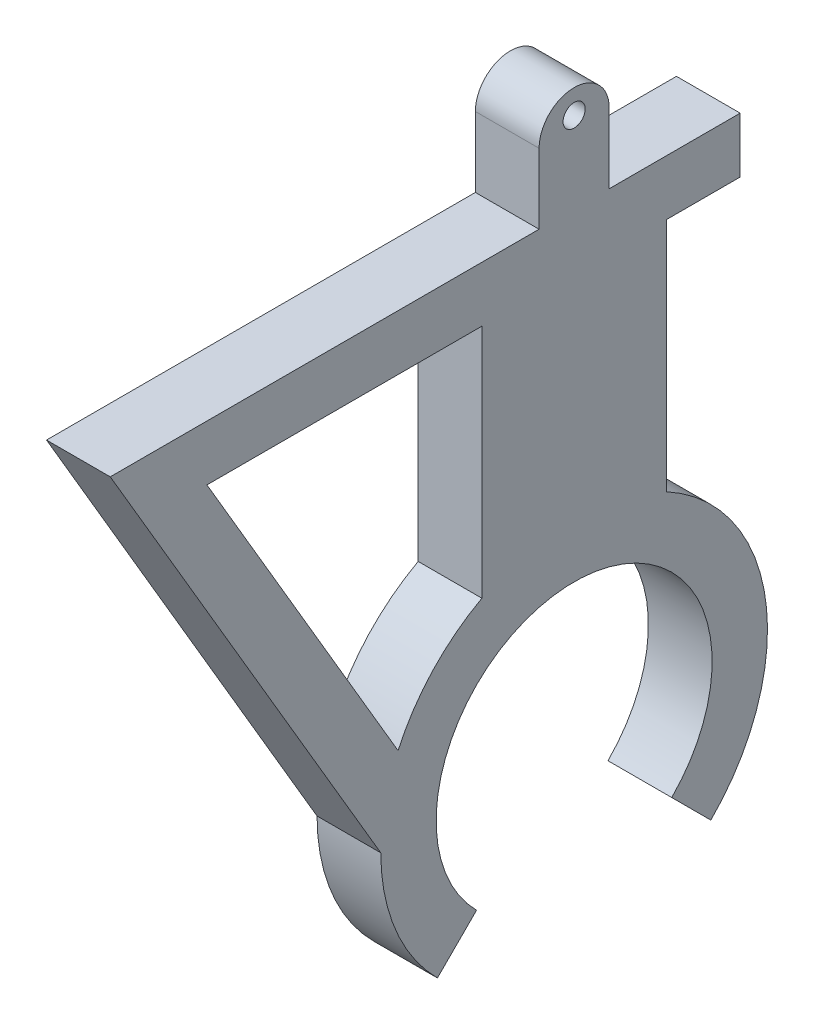
ISO-10303-21;
HEADER;
FILE_DESCRIPTION(('STEP AP214'),'2;1');
FILE_NAME('part.step','',(''),(''),'','','');
FILE_SCHEMA(('AUTOMOTIVE_DESIGN { 1 0 10303 214 1 1 1 1 }'));
ENDSEC;
DATA;
#1=APPLICATION_CONTEXT('core data for automotive mechanical design processes');
#2=APPLICATION_PROTOCOL_DEFINITION('international standard','automotive_design',2000,#1);
#3=PRODUCT_CONTEXT('',#1,'mechanical');
#4=PRODUCT('Part','Part','',(#3));
#5=PRODUCT_RELATED_PRODUCT_CATEGORY('part','',(#4));
#6=PRODUCT_DEFINITION_FORMATION('','',#4);
#7=PRODUCT_DEFINITION_CONTEXT('part definition',#1,'design');
#8=PRODUCT_DEFINITION('design','',#6,#7);
#9=PRODUCT_DEFINITION_SHAPE('','',#8);
#10=(LENGTH_UNIT() NAMED_UNIT(*) SI_UNIT(.MILLI.,.METRE.));
#11=(NAMED_UNIT(*) PLANE_ANGLE_UNIT() SI_UNIT($,.RADIAN.));
#12=(NAMED_UNIT(*) SI_UNIT($,.STERADIAN.) SOLID_ANGLE_UNIT());
#13=UNCERTAINTY_MEASURE_WITH_UNIT(LENGTH_MEASURE(1.E-05),#10,'distance_accuracy_value','');
#14=(GEOMETRIC_REPRESENTATION_CONTEXT(3) GLOBAL_UNCERTAINTY_ASSIGNED_CONTEXT((#13)) GLOBAL_UNIT_ASSIGNED_CONTEXT((#10,
#11,#12)) REPRESENTATION_CONTEXT('',''));
#15=CARTESIAN_POINT('',(0.,0.,0.));
#16=DIRECTION('',(0.,0.,1.));
#17=DIRECTION('',(1.,0.,0.));
#18=AXIS2_PLACEMENT_3D('',#15,#16,#17);
#19=CARTESIAN_POINT('',(1.7272,14.3906839385836,0.));
#20=DIRECTION('',(-1.,0.,0.));
#21=DIRECTION('',(0.,0.,1.));
#22=AXIS2_PLACEMENT_3D('',#19,#20,#21);
#23=CYLINDRICAL_SURFACE('',#22,0.95);
#24=CARTESIAN_POINT('',(0.,14.3906839385836,0.));
#25=DIRECTION('',(1.,0.,0.));
#26=DIRECTION('',(0.,0.,-1.));
#27=AXIS2_PLACEMENT_3D('',#24,#25,#26);
#28=CIRCLE('',#27,0.95);
#29=CARTESIAN_POINT('',(0.,14.3906839385836,0.95));
#30=VERTEX_POINT('',#29);
#31=CARTESIAN_POINT('',(0.,14.3906839385836,-0.95));
#32=VERTEX_POINT('',#31);
#33=EDGE_CURVE('E212',#30,#32,#28,.F.);
#34=ORIENTED_EDGE('',*,*,#33,.F.);
#35=DIRECTION('',(-1.,0.,0.));
#36=VECTOR('',#35,1.);
#37=CARTESIAN_POINT('',(1.7272,14.3906839385836,0.95));
#38=LINE('',#37,#36);
#39=CARTESIAN_POINT('',(1.7272,14.3906839385836,0.95));
#40=VERTEX_POINT('',#39);
#41=EDGE_CURVE('E11',#40,#30,#38,.T.);
#42=ORIENTED_EDGE('',*,*,#41,.F.);
#43=CARTESIAN_POINT('',(1.7272,14.3906839385836,0.));
#44=DIRECTION('',(1.,0.,0.));
#45=DIRECTION('',(0.,0.,-1.));
#46=AXIS2_PLACEMENT_3D('',#43,#44,#45);
#47=CIRCLE('',#46,0.95);
#48=CARTESIAN_POINT('',(1.7272,14.3906839385836,-0.95));
#49=VERTEX_POINT('',#48);
#50=EDGE_CURVE('E397',#40,#49,#47,.F.);
#51=ORIENTED_EDGE('',*,*,#50,.T.);
#52=DIRECTION('',(-1.,0.,0.));
#53=VECTOR('',#52,1.);
#54=CARTESIAN_POINT('',(1.7272,14.3906839385836,-0.95));
#55=LINE('',#54,#53);
#56=EDGE_CURVE('E54',#49,#32,#55,.T.);
#57=ORIENTED_EDGE('',*,*,#56,.T.);
#58=EDGE_LOOP('',(#34,#42,#51,#57));
#59=FACE_BOUND('',#58,.T.);
#60=ADVANCED_FACE('F35',(#59),#23,.T.);
#61=CARTESIAN_POINT('',(1.7272,5.90395315443278,0.95));
#62=DIRECTION('',(0.,0.,-1.));
#63=DIRECTION('',(0.,1.,0.));
#64=AXIS2_PLACEMENT_3D('',#61,#62,#63);
#65=PLANE('',#64);
#66=DIRECTION('',(0.,-1.,0.));
#67=VECTOR('',#66,1.);
#68=CARTESIAN_POINT('',(0.,5.90395315443278,0.95));
#69=LINE('',#68,#67);
#70=CARTESIAN_POINT('',(0.,12.4906839385836,0.95));
#71=VERTEX_POINT('',#70);
#72=EDGE_CURVE('E214',#30,#71,#69,.T.);
#73=ORIENTED_EDGE('',*,*,#72,.T.);
#74=DIRECTION('',(-1.,0.,0.));
#75=VECTOR('',#74,1.);
#76=CARTESIAN_POINT('',(1.7272,12.4906839385836,0.95));
#77=LINE('',#76,#75);
#78=CARTESIAN_POINT('',(1.7272,12.4906839385836,0.95));
#79=VERTEX_POINT('',#78);
#80=EDGE_CURVE('E45',#79,#71,#77,.T.);
#81=ORIENTED_EDGE('',*,*,#80,.F.);
#82=DIRECTION('',(0.,-1.,0.));
#83=VECTOR('',#82,1.);
#84=CARTESIAN_POINT('',(1.7272,5.90395315443278,0.95));
#85=LINE('',#84,#83);
#86=EDGE_CURVE('E399',#40,#79,#85,.T.);
#87=ORIENTED_EDGE('',*,*,#86,.F.);
#88=ORIENTED_EDGE('',*,*,#41,.T.);
#89=EDGE_LOOP('',(#73,#81,#87,#88));
#90=FACE_BOUND('',#89,.T.);
#91=ADVANCED_FACE('F308',(#90),#65,.F.);
#92=CARTESIAN_POINT('',(1.7272,12.4906839385836,-18.7723506815405));
#93=DIRECTION('',(0.,1.,0.));
#94=DIRECTION('',(0.,0.,1.));
#95=AXIS2_PLACEMENT_3D('',#92,#93,#94);
#96=PLANE('',#95);
#97=DIRECTION('',(0.,0.,-1.));
#98=VECTOR('',#97,1.);
#99=CARTESIAN_POINT('',(0.,12.4906839385836,-18.7723506815405));
#100=LINE('',#99,#98);
#101=CARTESIAN_POINT('',(0.,12.4906839385836,12.5716220282199));
#102=VERTEX_POINT('',#101);
#103=EDGE_CURVE('E217',#102,#71,#100,.T.);
#104=ORIENTED_EDGE('',*,*,#103,.F.);
#105=DIRECTION('',(-1.,0.,0.));
#106=VECTOR('',#105,1.);
#107=CARTESIAN_POINT('',(1.7272,12.4906839385836,12.5716220282199));
#108=LINE('',#107,#106);
#109=CARTESIAN_POINT('',(1.7272,12.4906839385836,12.5716220282199));
#110=VERTEX_POINT('',#109);
#111=EDGE_CURVE('E265',#110,#102,#108,.T.);
#112=ORIENTED_EDGE('',*,*,#111,.F.);
#113=DIRECTION('',(0.,0.,-1.));
#114=VECTOR('',#113,1.);
#115=CARTESIAN_POINT('',(1.7272,12.4906839385836,-18.7723506815405));
#116=LINE('',#115,#114);
#117=EDGE_CURVE('E402',#110,#79,#116,.T.);
#118=ORIENTED_EDGE('',*,*,#117,.T.);
#119=ORIENTED_EDGE('',*,*,#80,.T.);
#120=EDGE_LOOP('',(#104,#112,#118,#119));
#121=FACE_BOUND('',#120,.T.);
#122=ADVANCED_FACE('F313',(#121),#96,.T.);
#123=CARTESIAN_POINT('',(1.7272,-6.0917245583196,1.66435737056293));
#124=DIRECTION('',(0.,0.506207430960336,-0.86241175597306));
#125=DIRECTION('',(0.,0.86241175597306,0.506207430960336));
#126=AXIS2_PLACEMENT_3D('',#123,#124,#125);
#127=PLANE('',#126);
#128=DIRECTION('',(0.,-0.86241175597306,-0.506207430960336));
#129=VECTOR('',#128,1.);
#130=CARTESIAN_POINT('',(0.,-6.0917245583196,1.66435737056293));
#131=LINE('',#130,#129);
#132=CARTESIAN_POINT('',(0.,0.,5.24));
#133=VERTEX_POINT('',#132);
#134=EDGE_CURVE('E220',#102,#133,#131,.T.);
#135=ORIENTED_EDGE('',*,*,#134,.T.);
#136=DIRECTION('',(-1.,0.,0.));
#137=VECTOR('',#136,1.);
#138=CARTESIAN_POINT('',(1.7272,0.,5.24));
#139=LINE('',#138,#137);
#140=CARTESIAN_POINT('',(1.7272,0.,5.24));
#141=VERTEX_POINT('',#140);
#142=EDGE_CURVE('E263',#141,#133,#139,.T.);
#143=ORIENTED_EDGE('',*,*,#142,.F.);
#144=DIRECTION('',(0.,-0.86241175597306,-0.506207430960336));
#145=VECTOR('',#144,1.);
#146=CARTESIAN_POINT('',(1.7272,-6.0917245583196,1.66435737056293));
#147=LINE('',#146,#145);
#148=EDGE_CURVE('E379',#110,#141,#147,.T.);
#149=ORIENTED_EDGE('',*,*,#148,.F.);
#150=ORIENTED_EDGE('',*,*,#111,.T.);
#151=EDGE_LOOP('',(#135,#143,#149,#150));
#152=FACE_BOUND('',#151,.T.);
#153=ADVANCED_FACE('F305',(#152),#127,.F.);
#154=CARTESIAN_POINT('',(1.7272,0.,0.));
#155=DIRECTION('',(-1.,0.,0.));
#156=DIRECTION('',(0.,0.,1.));
#157=AXIS2_PLACEMENT_3D('',#154,#155,#156);
#158=CYLINDRICAL_SURFACE('',#157,5.24);
#159=CARTESIAN_POINT('',(0.,0.,0.));
#160=DIRECTION('',(1.,0.,0.));
#161=DIRECTION('',(0.,0.,-1.));
#162=AXIS2_PLACEMENT_3D('',#159,#160,#161);
#163=CIRCLE('',#162,5.24);
#164=CARTESIAN_POINT('',(0.,-3.70523953341749,3.70523953341752));
#165=VERTEX_POINT('',#164);
#166=EDGE_CURVE('E206',#165,#133,#163,.F.);
#167=ORIENTED_EDGE('',*,*,#166,.F.);
#168=DIRECTION('',(-1.,0.,0.));
#169=VECTOR('',#168,1.);
#170=CARTESIAN_POINT('',(1.7272,-3.70523953341749,3.70523953341752));
#171=LINE('',#170,#169);
#172=CARTESIAN_POINT('',(1.7272,-3.70523953341749,3.70523953341752));
#173=VERTEX_POINT('',#172);
#174=EDGE_CURVE('E261',#173,#165,#171,.T.);
#175=ORIENTED_EDGE('',*,*,#174,.F.);
#176=CARTESIAN_POINT('',(1.7272,0.,0.));
#177=DIRECTION('',(1.,0.,0.));
#178=DIRECTION('',(0.,0.,-1.));
#179=AXIS2_PLACEMENT_3D('',#176,#177,#178);
#180=CIRCLE('',#179,5.24);
#181=EDGE_CURVE('E377',#173,#141,#180,.F.);
#182=ORIENTED_EDGE('',*,*,#181,.T.);
#183=ORIENTED_EDGE('',*,*,#142,.T.);
#184=EDGE_LOOP('',(#167,#175,#182,#183));
#185=FACE_BOUND('',#184,.T.);
#186=ADVANCED_FACE('F294',(#185),#158,.T.);
#187=CARTESIAN_POINT('',(1.7272,12.3381519179866,-12.3381519179867));
#188=DIRECTION('',(0.,-0.707106781186552,-0.707106781186543));
#189=DIRECTION('',(0.,0.707106781186543,-0.707106781186552));
#190=AXIS2_PLACEMENT_3D('',#187,#188,#189);
#191=PLANE('',#190);
#192=DIRECTION('',(0.,-0.707106781186543,0.707106781186552));
#193=VECTOR('',#192,1.);
#194=CARTESIAN_POINT('',(0.,12.3381519179866,-12.3381519179867));
#195=LINE('',#194,#193);
#196=CARTESIAN_POINT('',(0.,-2.64457936163768,2.6445793616377));
#197=VERTEX_POINT('',#196);
#198=EDGE_CURVE('E223',#197,#165,#195,.T.);
#199=ORIENTED_EDGE('',*,*,#198,.F.);
#200=DIRECTION('',(-1.,0.,0.));
#201=VECTOR('',#200,1.);
#202=CARTESIAN_POINT('',(1.7272,-2.64457936163768,2.6445793616377));
#203=LINE('',#202,#201);
#204=CARTESIAN_POINT('',(1.7272,-2.64457936163768,2.6445793616377));
#205=VERTEX_POINT('',#204);
#206=EDGE_CURVE('E259',#205,#197,#203,.T.);
#207=ORIENTED_EDGE('',*,*,#206,.F.);
#208=DIRECTION('',(0.,-0.707106781186543,0.707106781186552));
#209=VECTOR('',#208,1.);
#210=CARTESIAN_POINT('',(1.7272,12.3381519179866,-12.3381519179867));
#211=LINE('',#210,#209);
#212=EDGE_CURVE('E373',#205,#173,#211,.T.);
#213=ORIENTED_EDGE('',*,*,#212,.T.);
#214=ORIENTED_EDGE('',*,*,#174,.T.);
#215=EDGE_LOOP('',(#199,#207,#213,#214));
#216=FACE_BOUND('',#215,.T.);
#217=ADVANCED_FACE('F304',(#216),#191,.T.);
#218=CARTESIAN_POINT('',(1.7272,0.,0.));
#219=DIRECTION('',(-1.,0.,0.));
#220=DIRECTION('',(0.,0.,1.));
#221=AXIS2_PLACEMENT_3D('',#218,#219,#220);
#222=CYLINDRICAL_SURFACE('',#221,3.74);
#223=CARTESIAN_POINT('',(0.,0.,0.));
#224=DIRECTION('',(1.,0.,0.));
#225=DIRECTION('',(0.,0.,-1.));
#226=AXIS2_PLACEMENT_3D('',#223,#224,#225);
#227=CIRCLE('',#226,3.74);
#228=CARTESIAN_POINT('',(0.,-2.64457936163768,-2.64457936163769));
#229=VERTEX_POINT('',#228);
#230=EDGE_CURVE('E226',#197,#229,#227,.F.);
#231=ORIENTED_EDGE('',*,*,#230,.T.);
#232=DIRECTION('',(-1.,0.,0.));
#233=VECTOR('',#232,1.);
#234=CARTESIAN_POINT('',(1.7272,-2.64457936163768,-2.64457936163769));
#235=LINE('',#234,#233);
#236=CARTESIAN_POINT('',(1.7272,-2.64457936163768,-2.64457936163769));
#237=VERTEX_POINT('',#236);
#238=EDGE_CURVE('E257',#237,#229,#235,.T.);
#239=ORIENTED_EDGE('',*,*,#238,.F.);
#240=CARTESIAN_POINT('',(1.7272,0.,0.));
#241=DIRECTION('',(1.,0.,0.));
#242=DIRECTION('',(0.,0.,-1.));
#243=AXIS2_PLACEMENT_3D('',#240,#241,#242);
#244=CIRCLE('',#243,3.74);
#245=EDGE_CURVE('E369',#205,#237,#244,.F.);
#246=ORIENTED_EDGE('',*,*,#245,.F.);
#247=ORIENTED_EDGE('',*,*,#206,.T.);
#248=EDGE_LOOP('',(#231,#239,#246,#247));
#249=FACE_BOUND('',#248,.T.);
#250=ADVANCED_FACE('F350',(#249),#222,.F.);
#251=CARTESIAN_POINT('',(1.7272,-6.43419876355384,-6.43419876355385));
#252=DIRECTION('',(0.,-0.707106781186548,0.707106781186547));
#253=DIRECTION('',(0.,-0.707106781186547,-0.707106781186548));
#254=AXIS2_PLACEMENT_3D('',#251,#252,#253);
#255=PLANE('',#254);
#256=DIRECTION('',(0.,0.707106781186547,0.707106781186548));
#257=VECTOR('',#256,1.);
#258=CARTESIAN_POINT('',(0.,-6.43419876355384,-6.43419876355385));
#259=LINE('',#258,#257);
#260=CARTESIAN_POINT('',(0.,-3.7052395334175,-3.70523953341751));
#261=VERTEX_POINT('',#260);
#262=EDGE_CURVE('E229',#261,#229,#259,.T.);
#263=ORIENTED_EDGE('',*,*,#262,.F.);
#264=DIRECTION('',(-1.,0.,0.));
#265=VECTOR('',#264,1.);
#266=CARTESIAN_POINT('',(1.7272,-3.7052395334175,-3.70523953341751));
#267=LINE('',#266,#265);
#268=CARTESIAN_POINT('',(1.7272,-3.7052395334175,-3.70523953341751));
#269=VERTEX_POINT('',#268);
#270=EDGE_CURVE('E255',#269,#261,#267,.T.);
#271=ORIENTED_EDGE('',*,*,#270,.F.);
#272=DIRECTION('',(0.,0.707106781186547,0.707106781186548));
#273=VECTOR('',#272,1.);
#274=CARTESIAN_POINT('',(1.7272,-6.43419876355384,-6.43419876355385));
#275=LINE('',#274,#273);
#276=EDGE_CURVE('E372',#269,#237,#275,.T.);
#277=ORIENTED_EDGE('',*,*,#276,.T.);
#278=ORIENTED_EDGE('',*,*,#238,.T.);
#279=EDGE_LOOP('',(#263,#271,#277,#278));
#280=FACE_BOUND('',#279,.T.);
#281=ADVANCED_FACE('F346',(#280),#255,.T.);
#282=CARTESIAN_POINT('',(1.7272,0.,0.));
#283=DIRECTION('',(-1.,0.,0.));
#284=DIRECTION('',(0.,0.,1.));
#285=AXIS2_PLACEMENT_3D('',#282,#283,#284);
#286=CYLINDRICAL_SURFACE('',#285,5.24);
#287=CARTESIAN_POINT('',(0.,0.,0.));
#288=DIRECTION('',(1.,0.,0.));
#289=DIRECTION('',(0.,0.,-1.));
#290=AXIS2_PLACEMENT_3D('',#287,#288,#289);
#291=CIRCLE('',#290,5.24);
#292=CARTESIAN_POINT('',(0.,4.60517100659682,-2.5));
#293=VERTEX_POINT('',#292);
#294=EDGE_CURVE('E232',#293,#261,#291,.F.);
#295=ORIENTED_EDGE('',*,*,#294,.F.);
#296=DIRECTION('',(-1.,0.,0.));
#297=VECTOR('',#296,1.);
#298=CARTESIAN_POINT('',(1.7272,4.60517100659682,-2.5));
#299=LINE('',#298,#297);
#300=CARTESIAN_POINT('',(1.7272,4.60517100659682,-2.5));
#301=VERTEX_POINT('',#300);
#302=EDGE_CURVE('E253',#301,#293,#299,.T.);
#303=ORIENTED_EDGE('',*,*,#302,.F.);
#304=CARTESIAN_POINT('',(1.7272,0.,0.));
#305=DIRECTION('',(1.,0.,0.));
#306=DIRECTION('',(0.,0.,-1.));
#307=AXIS2_PLACEMENT_3D('',#304,#305,#306);
#308=CIRCLE('',#307,5.24);
#309=EDGE_CURVE('E386',#301,#269,#308,.F.);
#310=ORIENTED_EDGE('',*,*,#309,.T.);
#311=ORIENTED_EDGE('',*,*,#270,.T.);
#312=EDGE_LOOP('',(#295,#303,#310,#311));
#313=FACE_BOUND('',#312,.T.);
#314=ADVANCED_FACE('F342',(#313),#286,.T.);
#315=CARTESIAN_POINT('',(1.7272,5.90395315443278,-2.5));
#316=DIRECTION('',(0.,0.,-1.));
#317=DIRECTION('',(0.,1.,0.));
#318=AXIS2_PLACEMENT_3D('',#315,#316,#317);
#319=PLANE('',#318);
#320=DIRECTION('',(0.,-1.,0.));
#321=VECTOR('',#320,1.);
#322=CARTESIAN_POINT('',(0.,5.90395315443278,-2.5));
#323=LINE('',#322,#321);
#324=CARTESIAN_POINT('',(0.,10.9906839385836,-2.5));
#325=VERTEX_POINT('',#324);
#326=EDGE_CURVE('E235',#325,#293,#323,.T.);
#327=ORIENTED_EDGE('',*,*,#326,.F.);
#328=DIRECTION('',(-1.,0.,0.));
#329=VECTOR('',#328,1.);
#330=CARTESIAN_POINT('',(1.7272,10.9906839385836,-2.5));
#331=LINE('',#330,#329);
#332=CARTESIAN_POINT('',(1.7272,10.9906839385836,-2.5));
#333=VERTEX_POINT('',#332);
#334=EDGE_CURVE('E251',#333,#325,#331,.T.);
#335=ORIENTED_EDGE('',*,*,#334,.F.);
#336=DIRECTION('',(0.,-1.,0.));
#337=VECTOR('',#336,1.);
#338=CARTESIAN_POINT('',(1.7272,5.90395315443278,-2.5));
#339=LINE('',#338,#337);
#340=EDGE_CURVE('E389',#333,#301,#339,.T.);
#341=ORIENTED_EDGE('',*,*,#340,.T.);
#342=ORIENTED_EDGE('',*,*,#302,.T.);
#343=EDGE_LOOP('',(#327,#335,#341,#342));
#344=FACE_BOUND('',#343,.T.);
#345=ADVANCED_FACE('F338',(#344),#319,.T.);
#346=CARTESIAN_POINT('',(1.7272,10.9906839385836,-18.7723506815405));
#347=DIRECTION('',(0.,1.,0.));
#348=DIRECTION('',(0.,0.,1.));
#349=AXIS2_PLACEMENT_3D('',#346,#347,#348);
#350=PLANE('',#349);
#351=DIRECTION('',(0.,0.,-1.));
#352=VECTOR('',#351,1.);
#353=CARTESIAN_POINT('',(0.,10.9906839385836,-18.7723506815405));
#354=LINE('',#353,#352);
#355=CARTESIAN_POINT('',(0.,10.9906839385836,-4.5));
#356=VERTEX_POINT('',#355);
#357=EDGE_CURVE('E238',#325,#356,#354,.T.);
#358=ORIENTED_EDGE('',*,*,#357,.T.);
#359=DIRECTION('',(-1.,0.,0.));
#360=VECTOR('',#359,1.);
#361=CARTESIAN_POINT('',(1.7272,10.9906839385836,-4.5));
#362=LINE('',#361,#360);
#363=CARTESIAN_POINT('',(1.7272,10.9906839385836,-4.5));
#364=VERTEX_POINT('',#363);
#365=EDGE_CURVE('E176',#364,#356,#362,.T.);
#366=ORIENTED_EDGE('',*,*,#365,.F.);
#367=DIRECTION('',(0.,0.,-1.));
#368=VECTOR('',#367,1.);
#369=CARTESIAN_POINT('',(1.7272,10.9906839385836,-18.7723506815405));
#370=LINE('',#369,#368);
#371=EDGE_CURVE('E186',#333,#364,#370,.T.);
#372=ORIENTED_EDGE('',*,*,#371,.F.);
#373=ORIENTED_EDGE('',*,*,#334,.T.);
#374=EDGE_LOOP('',(#358,#366,#372,#373));
#375=FACE_BOUND('',#374,.T.);
#376=ADVANCED_FACE('F335',(#375),#350,.F.);
#377=CARTESIAN_POINT('',(1.7272,5.90395315443277,-4.5));
#378=DIRECTION('',(0.,0.,-1.));
#379=DIRECTION('',(0.,1.,0.));
#380=AXIS2_PLACEMENT_3D('',#377,#378,#379);
#381=PLANE('',#380);
#382=DIRECTION('',(0.,-1.,0.));
#383=VECTOR('',#382,1.);
#384=CARTESIAN_POINT('',(0.,5.90395315443277,-4.5));
#385=LINE('',#384,#383);
#386=CARTESIAN_POINT('',(0.,12.4906839385836,-4.5));
#387=VERTEX_POINT('',#386);
#388=EDGE_CURVE('E172',#387,#356,#385,.T.);
#389=ORIENTED_EDGE('',*,*,#388,.F.);
#390=DIRECTION('',(-1.,0.,0.));
#391=VECTOR('',#390,1.);
#392=CARTESIAN_POINT('',(1.7272,12.4906839385836,-4.5));
#393=LINE('',#392,#391);
#394=CARTESIAN_POINT('',(1.7272,12.4906839385836,-4.5));
#395=VERTEX_POINT('',#394);
#396=EDGE_CURVE('E167',#395,#387,#393,.T.);
#397=ORIENTED_EDGE('',*,*,#396,.F.);
#398=DIRECTION('',(0.,-1.,0.));
#399=VECTOR('',#398,1.);
#400=CARTESIAN_POINT('',(1.7272,5.90395315443277,-4.5));
#401=LINE('',#400,#399);
#402=EDGE_CURVE('E170',#395,#364,#401,.T.);
#403=ORIENTED_EDGE('',*,*,#402,.T.);
#404=ORIENTED_EDGE('',*,*,#365,.T.);
#405=EDGE_LOOP('',(#389,#397,#403,#404));
#406=FACE_BOUND('',#405,.T.);
#407=ADVANCED_FACE('F169',(#406),#381,.T.);
#408=CARTESIAN_POINT('',(1.7272,12.4906839385836,-18.7723506815405));
#409=DIRECTION('',(0.,1.,0.));
#410=DIRECTION('',(0.,0.,1.));
#411=AXIS2_PLACEMENT_3D('',#408,#409,#410);
#412=PLANE('',#411);
#413=DIRECTION('',(0.,0.,-1.));
#414=VECTOR('',#413,1.);
#415=CARTESIAN_POINT('',(0.,12.4906839385836,-18.7723506815405));
#416=LINE('',#415,#414);
#417=CARTESIAN_POINT('',(0.,12.4906839385836,-0.95));
#418=VERTEX_POINT('',#417);
#419=EDGE_CURVE('E242',#418,#387,#416,.T.);
#420=ORIENTED_EDGE('',*,*,#419,.F.);
#421=DIRECTION('',(-1.,0.,0.));
#422=VECTOR('',#421,1.);
#423=CARTESIAN_POINT('',(1.7272,12.4906839385836,-0.95));
#424=LINE('',#423,#422);
#425=CARTESIAN_POINT('',(1.7272,12.4906839385836,-0.95));
#426=VERTEX_POINT('',#425);
#427=EDGE_CURVE('E109',#426,#418,#424,.T.);
#428=ORIENTED_EDGE('',*,*,#427,.F.);
#429=DIRECTION('',(0.,0.,-1.));
#430=VECTOR('',#429,1.);
#431=CARTESIAN_POINT('',(1.7272,12.4906839385836,-18.7723506815405));
#432=LINE('',#431,#430);
#433=EDGE_CURVE('E183',#426,#395,#432,.T.);
#434=ORIENTED_EDGE('',*,*,#433,.T.);
#435=ORIENTED_EDGE('',*,*,#396,.T.);
#436=EDGE_LOOP('',(#420,#428,#434,#435));
#437=FACE_BOUND('',#436,.T.);
#438=ADVANCED_FACE('F189',(#437),#412,.T.);
#439=CARTESIAN_POINT('',(1.7272,10.9906839385836,-18.7723506815405));
#440=DIRECTION('',(0.,-1.,0.));
#441=DIRECTION('',(0.,0.,-1.));
#442=AXIS2_PLACEMENT_3D('',#439,#440,#441);
#443=PLANE('',#442);
#444=DIRECTION('',(0.,0.,1.));
#445=VECTOR('',#444,1.);
#446=CARTESIAN_POINT('',(0.,10.9906839385836,-18.7723506815405));
#447=LINE('',#446,#445);
#448=CARTESIAN_POINT('',(0.,10.9906839385836,2.5));
#449=VERTEX_POINT('',#448);
#450=CARTESIAN_POINT('',(0.,10.9906839385836,9.951862811358));
#451=VERTEX_POINT('',#450);
#452=EDGE_CURVE('E196',#449,#451,#447,.T.);
#453=ORIENTED_EDGE('',*,*,#452,.F.);
#454=DIRECTION('',(-1.,0.,0.));
#455=VECTOR('',#454,1.);
#456=CARTESIAN_POINT('',(1.7272,10.9906839385836,2.5));
#457=LINE('',#456,#455);
#458=CARTESIAN_POINT('',(1.7272,10.9906839385836,2.5));
#459=VERTEX_POINT('',#458);
#460=EDGE_CURVE('E39',#459,#449,#457,.T.);
#461=ORIENTED_EDGE('',*,*,#460,.F.);
#462=DIRECTION('',(0.,0.,1.));
#463=VECTOR('',#462,1.);
#464=CARTESIAN_POINT('',(1.7272,10.9906839385836,-18.7723506815405));
#465=LINE('',#464,#463);
#466=CARTESIAN_POINT('',(1.7272,10.9906839385836,9.951862811358));
#467=VERTEX_POINT('',#466);
#468=EDGE_CURVE('E247',#459,#467,#465,.T.);
#469=ORIENTED_EDGE('',*,*,#468,.T.);
#470=DIRECTION('',(-1.,0.,0.));
#471=VECTOR('',#470,1.);
#472=CARTESIAN_POINT('',(1.7272,10.9906839385836,9.951862811358));
#473=LINE('',#472,#471);
#474=EDGE_CURVE('E192',#467,#451,#473,.T.);
#475=ORIENTED_EDGE('',*,*,#474,.T.);
#476=EDGE_LOOP('',(#453,#461,#469,#475));
#477=FACE_BOUND('',#476,.T.);
#478=ADVANCED_FACE('F37',(#477),#443,.T.);
#479=CARTESIAN_POINT('',(1.7272,5.90395315443278,2.5));
#480=DIRECTION('',(0.,0.,-1.));
#481=DIRECTION('',(-1.,0.,0.));
#482=AXIS2_PLACEMENT_3D('',#479,#480,#481);
#483=PLANE('',#482);
#484=DIRECTION('',(0.,-1.,0.));
#485=VECTOR('',#484,1.);
#486=CARTESIAN_POINT('',(0.,5.90395315443278,2.5));
#487=LINE('',#486,#485);
#488=CARTESIAN_POINT('',(0.,4.60517100659682,2.5));
#489=VERTEX_POINT('',#488);
#490=EDGE_CURVE('E199',#449,#489,#487,.T.);
#491=ORIENTED_EDGE('',*,*,#490,.T.);
#492=DIRECTION('',(-1.,0.,0.));
#493=VECTOR('',#492,1.);
#494=CARTESIAN_POINT('',(1.7272,4.60517100659682,2.5));
#495=LINE('',#494,#493);
#496=CARTESIAN_POINT('',(1.7272,4.60517100659682,2.5));
#497=VERTEX_POINT('',#496);
#498=EDGE_CURVE('E270',#497,#489,#495,.T.);
#499=ORIENTED_EDGE('',*,*,#498,.F.);
#500=DIRECTION('',(0.,-1.,0.));
#501=VECTOR('',#500,1.);
#502=CARTESIAN_POINT('',(1.7272,5.90395315443278,2.5));
#503=LINE('',#502,#501);
#504=EDGE_CURVE('E278',#459,#497,#503,.T.);
#505=ORIENTED_EDGE('',*,*,#504,.F.);
#506=ORIENTED_EDGE('',*,*,#460,.T.);
#507=EDGE_LOOP('',(#491,#499,#505,#506));
#508=FACE_BOUND('',#507,.T.);
#509=ADVANCED_FACE('F277',(#508),#483,.F.);
#510=CARTESIAN_POINT('',(0.,2.16534184657343,4.77167629743237));
#511=VERTEX_POINT('',#510);
#512=EDGE_CURVE('E202',#511,#489,#163,.F.);
#513=ORIENTED_EDGE('',*,*,#512,.F.);
#514=DIRECTION('',(-1.,0.,0.));
#515=VECTOR('',#514,1.);
#516=CARTESIAN_POINT('',(1.7272,2.16534184657343,4.77167629743237));
#517=LINE('',#516,#515);
#518=CARTESIAN_POINT('',(1.7272,2.16534184657343,4.77167629743237));
#519=VERTEX_POINT('',#518);
#520=EDGE_CURVE('E269',#519,#511,#517,.T.);
#521=ORIENTED_EDGE('',*,*,#520,.F.);
#522=EDGE_CURVE('E381',#519,#497,#180,.F.);
#523=ORIENTED_EDGE('',*,*,#522,.T.);
#524=ORIENTED_EDGE('',*,*,#498,.T.);
#525=EDGE_LOOP('',(#513,#521,#523,#524));
#526=FACE_BOUND('',#525,.T.);
#527=ADVANCED_FACE('F290',(#526),#158,.T.);
#528=CARTESIAN_POINT('',(1.7272,14.6906839385836,0.));
#529=DIRECTION('',(-1.,0.,0.));
#530=DIRECTION('',(0.,0.,1.));
#531=AXIS2_PLACEMENT_3D('',#528,#529,#530);
#532=CYLINDRICAL_SURFACE('',#531,0.300000000000002);
#533=CARTESIAN_POINT('',(1.7272,14.6906839385836,0.));
#534=DIRECTION('',(1.,0.,0.));
#535=DIRECTION('',(0.,0.,-1.));
#536=AXIS2_PLACEMENT_3D('',#533,#534,#535);
#537=CIRCLE('',#536,0.300000000000002);
#538=CARTESIAN_POINT('',(1.7272,14.6906839385836,-0.300000000000002));
#539=VERTEX_POINT('',#538);
#540=EDGE_CURVE('E404',#539,#539,#537,.T.);
#541=ORIENTED_EDGE('',*,*,#540,.T.);
#542=EDGE_LOOP('',(#541));
#543=FACE_BOUND('',#542,.T.);
#544=CARTESIAN_POINT('',(0.,14.6906839385836,0.));
#545=DIRECTION('',(1.,0.,0.));
#546=DIRECTION('',(0.,0.,-1.));
#547=AXIS2_PLACEMENT_3D('',#544,#545,#546);
#548=CIRCLE('',#547,0.300000000000002);
#549=CARTESIAN_POINT('',(0.,14.6906839385836,-0.300000000000002));
#550=VERTEX_POINT('',#549);
#551=EDGE_CURVE('E209',#550,#550,#548,.T.);
#552=ORIENTED_EDGE('',*,*,#551,.F.);
#553=EDGE_LOOP('',(#552));
#554=FACE_BOUND('',#553,.T.);
#555=ADVANCED_FACE('F292',(#543,#554),#532,.F.);
#556=CARTESIAN_POINT('',(1.7272,-5.33241341187909,0.370739736603343));
#557=DIRECTION('',(0.,0.506207430960336,-0.86241175597306));
#558=DIRECTION('',(0.,0.86241175597306,0.506207430960336));
#559=AXIS2_PLACEMENT_3D('',#556,#557,#558);
#560=PLANE('',#559);
#561=DIRECTION('',(0.,-0.86241175597306,-0.506207430960336));
#562=VECTOR('',#561,1.);
#563=CARTESIAN_POINT('',(0.,-5.33241341187909,0.370739736603343));
#564=LINE('',#563,#562);
#565=EDGE_CURVE('E205',#451,#511,#564,.T.);
#566=ORIENTED_EDGE('',*,*,#565,.F.);
#567=ORIENTED_EDGE('',*,*,#474,.F.);
#568=DIRECTION('',(0.,-0.86241175597306,-0.506207430960336));
#569=VECTOR('',#568,1.);
#570=CARTESIAN_POINT('',(1.7272,-5.33241341187909,0.370739736603343));
#571=LINE('',#570,#569);
#572=EDGE_CURVE('E288',#467,#519,#571,.T.);
#573=ORIENTED_EDGE('',*,*,#572,.T.);
#574=ORIENTED_EDGE('',*,*,#520,.T.);
#575=EDGE_LOOP('',(#566,#567,#573,#574));
#576=FACE_BOUND('',#575,.T.);
#577=ADVANCED_FACE('F287',(#576),#560,.T.);
#578=CARTESIAN_POINT('',(1.7272,5.90395315443278,-0.95));
#579=DIRECTION('',(0.,0.,-1.));
#580=DIRECTION('',(0.,1.,0.));
#581=AXIS2_PLACEMENT_3D('',#578,#579,#580);
#582=PLANE('',#581);
#583=DIRECTION('',(0.,-1.,0.));
#584=VECTOR('',#583,1.);
#585=CARTESIAN_POINT('',(0.,5.90395315443278,-0.95));
#586=LINE('',#585,#584);
#587=EDGE_CURVE('E244',#32,#418,#586,.T.);
#588=ORIENTED_EDGE('',*,*,#587,.F.);
#589=ORIENTED_EDGE('',*,*,#56,.F.);
#590=DIRECTION('',(0.,-1.,0.));
#591=VECTOR('',#590,1.);
#592=CARTESIAN_POINT('',(1.7272,5.90395315443278,-0.95));
#593=LINE('',#592,#591);
#594=EDGE_CURVE('E190',#49,#426,#593,.T.);
#595=ORIENTED_EDGE('',*,*,#594,.T.);
#596=ORIENTED_EDGE('',*,*,#427,.T.);
#597=EDGE_LOOP('',(#588,#589,#595,#596));
#598=FACE_BOUND('',#597,.T.);
#599=ADVANCED_FACE('F319',(#598),#582,.T.);
#600=CARTESIAN_POINT('',(1.7272,5.90395315443278,-18.7723506815405));
#601=DIRECTION('',(1.,0.,0.));
#602=DIRECTION('',(0.,0.,-1.));
#603=AXIS2_PLACEMENT_3D('',#600,#601,#602);
#604=PLANE('',#603);
#605=ORIENTED_EDGE('',*,*,#468,.F.);
#606=ORIENTED_EDGE('',*,*,#504,.T.);
#607=ORIENTED_EDGE('',*,*,#522,.F.);
#608=ORIENTED_EDGE('',*,*,#572,.F.);
#609=EDGE_LOOP('',(#605,#606,#607,#608));
#610=FACE_BOUND('',#609,.T.);
#611=ORIENTED_EDGE('',*,*,#540,.F.);
#612=EDGE_LOOP('',(#611));
#613=FACE_BOUND('',#612,.T.);
#614=ORIENTED_EDGE('',*,*,#50,.F.);
#615=ORIENTED_EDGE('',*,*,#86,.T.);
#616=ORIENTED_EDGE('',*,*,#117,.F.);
#617=ORIENTED_EDGE('',*,*,#148,.T.);
#618=ORIENTED_EDGE('',*,*,#181,.F.);
#619=ORIENTED_EDGE('',*,*,#212,.F.);
#620=ORIENTED_EDGE('',*,*,#245,.T.);
#621=ORIENTED_EDGE('',*,*,#276,.F.);
#622=ORIENTED_EDGE('',*,*,#309,.F.);
#623=ORIENTED_EDGE('',*,*,#340,.F.);
#624=ORIENTED_EDGE('',*,*,#371,.T.);
#625=ORIENTED_EDGE('',*,*,#402,.F.);
#626=ORIENTED_EDGE('',*,*,#433,.F.);
#627=ORIENTED_EDGE('',*,*,#594,.F.);
#628=EDGE_LOOP('',(#614,#615,#616,#617,#618,#619,#620,#621,#622,#623,#624,#625,#626,#627));
#629=FACE_BOUND('',#628,.T.);
#630=ADVANCED_FACE('F181',(#610,#613,#629),#604,.T.);
#631=CARTESIAN_POINT('',(0.,5.90395315443278,-18.7723506815405));
#632=DIRECTION('',(1.,0.,0.));
#633=DIRECTION('',(0.,0.,-1.));
#634=AXIS2_PLACEMENT_3D('',#631,#632,#633);
#635=PLANE('',#634);
#636=ORIENTED_EDGE('',*,*,#452,.T.);
#637=ORIENTED_EDGE('',*,*,#565,.T.);
#638=ORIENTED_EDGE('',*,*,#512,.T.);
#639=ORIENTED_EDGE('',*,*,#490,.F.);
#640=EDGE_LOOP('',(#636,#637,#638,#639));
#641=FACE_BOUND('',#640,.T.);
#642=ORIENTED_EDGE('',*,*,#551,.T.);
#643=EDGE_LOOP('',(#642));
#644=FACE_BOUND('',#643,.T.);
#645=ORIENTED_EDGE('',*,*,#33,.T.);
#646=ORIENTED_EDGE('',*,*,#587,.T.);
#647=ORIENTED_EDGE('',*,*,#419,.T.);
#648=ORIENTED_EDGE('',*,*,#388,.T.);
#649=ORIENTED_EDGE('',*,*,#357,.F.);
#650=ORIENTED_EDGE('',*,*,#326,.T.);
#651=ORIENTED_EDGE('',*,*,#294,.T.);
#652=ORIENTED_EDGE('',*,*,#262,.T.);
#653=ORIENTED_EDGE('',*,*,#230,.F.);
#654=ORIENTED_EDGE('',*,*,#198,.T.);
#655=ORIENTED_EDGE('',*,*,#166,.T.);
#656=ORIENTED_EDGE('',*,*,#134,.F.);
#657=ORIENTED_EDGE('',*,*,#103,.T.);
#658=ORIENTED_EDGE('',*,*,#72,.F.);
#659=EDGE_LOOP('',(#645,#646,#647,#648,#649,#650,#651,#652,#653,#654,#655,#656,#657,#658));
#660=FACE_BOUND('',#659,.T.);
#661=ADVANCED_FACE('F281',(#641,#644,#660),#635,.F.);
#662=CLOSED_SHELL('',(#60,#91,#122,#153,#186,#217,#250,#281,#314,#345,#376,#407,#438,#478,#509,
#527,#555,#577,#599,#630,#661));
#663=MANIFOLD_SOLID_BREP('B2',#662);
#664=ADVANCED_BREP_SHAPE_REPRESENTATION('',(#18,#663),#14);
#665=SHAPE_DEFINITION_REPRESENTATION(#9,#664);
ENDSEC;
END-ISO-10303-21;
